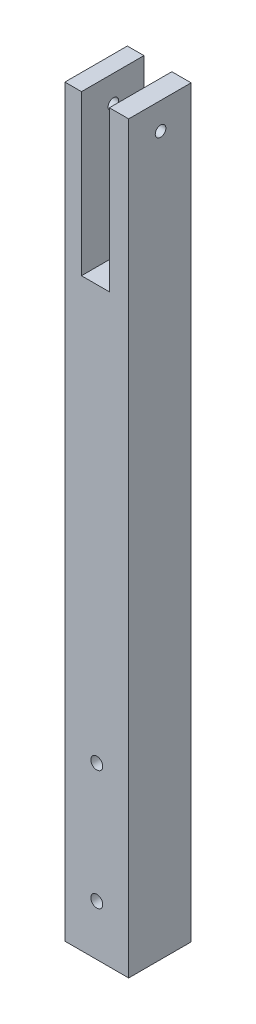
ISO-10303-21;
HEADER;
FILE_DESCRIPTION(('STEP AP214'),'2;1');
FILE_NAME('part.step','',(''),(''),'','','');
FILE_SCHEMA(('AUTOMOTIVE_DESIGN { 1 0 10303 214 1 1 1 1 }'));
ENDSEC;
DATA;
#1=APPLICATION_CONTEXT('core data for automotive mechanical design processes');
#2=APPLICATION_PROTOCOL_DEFINITION('international standard','automotive_design',2000,#1);
#3=PRODUCT_CONTEXT('',#1,'mechanical');
#4=PRODUCT('Part','Part','',(#3));
#5=PRODUCT_RELATED_PRODUCT_CATEGORY('part','',(#4));
#6=PRODUCT_DEFINITION_FORMATION('','',#4);
#7=PRODUCT_DEFINITION_CONTEXT('part definition',#1,'design');
#8=PRODUCT_DEFINITION('design','',#6,#7);
#9=PRODUCT_DEFINITION_SHAPE('','',#8);
#10=(LENGTH_UNIT() NAMED_UNIT(*) SI_UNIT(.MILLI.,.METRE.));
#11=(NAMED_UNIT(*) PLANE_ANGLE_UNIT() SI_UNIT($,.RADIAN.));
#12=(NAMED_UNIT(*) SI_UNIT($,.STERADIAN.) SOLID_ANGLE_UNIT());
#13=UNCERTAINTY_MEASURE_WITH_UNIT(LENGTH_MEASURE(1.E-05),#10,'distance_accuracy_value','');
#14=(GEOMETRIC_REPRESENTATION_CONTEXT(3) GLOBAL_UNCERTAINTY_ASSIGNED_CONTEXT((#13)) GLOBAL_UNIT_ASSIGNED_CONTEXT((#10,
#11,#12)) REPRESENTATION_CONTEXT('',''));
#15=CARTESIAN_POINT('',(0.,0.,0.));
#16=DIRECTION('',(0.,0.,1.));
#17=DIRECTION('',(1.,0.,0.));
#18=AXIS2_PLACEMENT_3D('',#15,#16,#17);
#19=CARTESIAN_POINT('',(-17.7152451401498,221.467203596135,24.));
#20=DIRECTION('',(0.,-1.,0.));
#21=DIRECTION('',(0.,0.,-1.));
#22=AXIS2_PLACEMENT_3D('',#19,#20,#21);
#23=PLANE('',#22);
#24=DIRECTION('',(0.,0.,-1.));
#25=VECTOR('',#24,1.);
#26=CARTESIAN_POINT('',(6.28475485985022,221.467203596135,24.));
#27=LINE('',#26,#25);
#28=CARTESIAN_POINT('',(6.28475485985022,221.467203596135,24.));
#29=VERTEX_POINT('',#28);
#30=CARTESIAN_POINT('',(6.28475485985022,221.467203596135,0.5));
#31=VERTEX_POINT('',#30);
#32=EDGE_CURVE('E179',#29,#31,#27,.T.);
#33=ORIENTED_EDGE('',*,*,#32,.T.);
#34=DIRECTION('',(-1.,0.,0.));
#35=VECTOR('',#34,1.);
#36=CARTESIAN_POINT('',(-17.7152451401498,221.467203596135,0.500000000000028));
#37=LINE('',#36,#35);
#38=CARTESIAN_POINT('',(-0.96524514014978,221.467203596135,0.500000000000028));
#39=VERTEX_POINT('',#38);
#40=EDGE_CURVE('E213',#31,#39,#37,.T.);
#41=ORIENTED_EDGE('',*,*,#40,.T.);
#42=DIRECTION('',(0.,0.,-1.));
#43=VECTOR('',#42,1.);
#44=CARTESIAN_POINT('',(-0.965245140149777,221.467203596135,24.));
#45=LINE('',#44,#43);
#46=CARTESIAN_POINT('',(-0.965245140149777,221.467203596135,24.));
#47=VERTEX_POINT('',#46);
#48=EDGE_CURVE('E158',#47,#39,#45,.T.);
#49=ORIENTED_EDGE('',*,*,#48,.F.);
#50=DIRECTION('',(-1.,0.,0.));
#51=VECTOR('',#50,1.);
#52=CARTESIAN_POINT('',(-17.7152451401498,221.467203596135,24.));
#53=LINE('',#52,#51);
#54=EDGE_CURVE('E168',#29,#47,#53,.T.);
#55=ORIENTED_EDGE('',*,*,#54,.F.);
#56=EDGE_LOOP('',(#33,#41,#49,#55));
#57=FACE_BOUND('',#56,.T.);
#58=ADVANCED_FACE('F37',(#57),#23,.F.);
#59=DIRECTION('',(0.,0.,1.));
#60=VECTOR('',#59,1.);
#61=CARTESIAN_POINT('',(-11.4652451401498,221.467203596135,24.));
#62=LINE('',#61,#60);
#63=CARTESIAN_POINT('',(-11.4652451401498,221.467203596135,0.500000000000028));
#64=VERTEX_POINT('',#63);
#65=CARTESIAN_POINT('',(-11.4652451401498,221.467203596135,24.));
#66=VERTEX_POINT('',#65);
#67=EDGE_CURVE('E146',#64,#66,#62,.T.);
#68=ORIENTED_EDGE('',*,*,#67,.F.);
#69=DIRECTION('',(-1.,0.,0.));
#70=VECTOR('',#69,1.);
#71=CARTESIAN_POINT('',(-17.7152451401498,221.467203596135,0.499999999999973));
#72=LINE('',#71,#70);
#73=CARTESIAN_POINT('',(-17.7152451401498,221.467203596135,0.499999999999973));
#74=VERTEX_POINT('',#73);
#75=EDGE_CURVE('E206',#64,#74,#72,.T.);
#76=ORIENTED_EDGE('',*,*,#75,.T.);
#77=DIRECTION('',(0.,0.,-1.));
#78=VECTOR('',#77,1.);
#79=CARTESIAN_POINT('',(-17.7152451401498,221.467203596135,24.));
#80=LINE('',#79,#78);
#81=CARTESIAN_POINT('',(-17.7152451401498,221.467203596135,24.));
#82=VERTEX_POINT('',#81);
#83=EDGE_CURVE('E180',#82,#74,#80,.T.);
#84=ORIENTED_EDGE('',*,*,#83,.F.);
#85=EDGE_CURVE('E166',#66,#82,#53,.T.);
#86=ORIENTED_EDGE('',*,*,#85,.F.);
#87=EDGE_LOOP('',(#68,#76,#84,#86));
#88=FACE_BOUND('',#87,.T.);
#89=ADVANCED_FACE('F286',(#88),#23,.F.);
#90=CARTESIAN_POINT('',(0.,0.,24.));
#91=DIRECTION('',(0.,0.,1.));
#92=DIRECTION('',(1.,0.,0.));
#93=AXIS2_PLACEMENT_3D('',#90,#91,#92);
#94=PLANE('',#93);
#95=CARTESIAN_POINT('',(-5.71524514014978,-39.4827964038655,24.));
#96=DIRECTION('',(0.,0.,1.));
#97=DIRECTION('',(1.,0.,0.));
#98=AXIS2_PLACEMENT_3D('',#95,#96,#97);
#99=CIRCLE('',#98,2.25);
#100=CARTESIAN_POINT('',(-3.46524514014977,-39.4827964038655,24.));
#101=VERTEX_POINT('',#100);
#102=EDGE_CURVE('E382',#101,#101,#99,.T.);
#103=ORIENTED_EDGE('',*,*,#102,.F.);
#104=EDGE_LOOP('',(#103));
#105=FACE_BOUND('',#104,.T.);
#106=CARTESIAN_POINT('',(-5.71524514014978,5.51720359613449,24.));
#107=DIRECTION('',(0.,0.,1.));
#108=DIRECTION('',(1.,0.,0.));
#109=AXIS2_PLACEMENT_3D('',#106,#107,#108);
#110=CIRCLE('',#109,2.25);
#111=CARTESIAN_POINT('',(-3.46524514014978,5.51720359613449,24.));
#112=VERTEX_POINT('',#111);
#113=EDGE_CURVE('E384',#112,#112,#110,.T.);
#114=ORIENTED_EDGE('',*,*,#113,.F.);
#115=EDGE_LOOP('',(#114));
#116=FACE_BOUND('',#115,.T.);
#117=DIRECTION('',(1.,0.,0.));
#118=VECTOR('',#117,1.);
#119=CARTESIAN_POINT('',(-0.965245140149777,161.467203596135,24.));
#120=LINE('',#119,#118);
#121=CARTESIAN_POINT('',(-11.4652451401498,161.467203596135,24.));
#122=VERTEX_POINT('',#121);
#123=CARTESIAN_POINT('',(-0.965245140149777,161.467203596135,24.));
#124=VERTEX_POINT('',#123);
#125=EDGE_CURVE('E133',#122,#124,#120,.T.);
#126=ORIENTED_EDGE('',*,*,#125,.F.);
#127=DIRECTION('',(0.,1.,0.));
#128=VECTOR('',#127,1.);
#129=CARTESIAN_POINT('',(-11.4652451401498,161.467203596135,24.));
#130=LINE('',#129,#128);
#131=EDGE_CURVE('E144',#122,#66,#130,.T.);
#132=ORIENTED_EDGE('',*,*,#131,.T.);
#133=ORIENTED_EDGE('',*,*,#85,.T.);
#134=DIRECTION('',(0.,-1.,0.));
#135=VECTOR('',#134,1.);
#136=CARTESIAN_POINT('',(-17.7152451401498,-58.5327964038655,24.));
#137=LINE('',#136,#135);
#138=CARTESIAN_POINT('',(-17.7152451401498,-58.5327964038655,24.));
#139=VERTEX_POINT('',#138);
#140=EDGE_CURVE('E174',#82,#139,#137,.T.);
#141=ORIENTED_EDGE('',*,*,#140,.T.);
#142=DIRECTION('',(1.,0.,0.));
#143=VECTOR('',#142,1.);
#144=CARTESIAN_POINT('',(-17.7152451401498,-58.5327964038655,24.));
#145=LINE('',#144,#143);
#146=CARTESIAN_POINT('',(6.28475485985022,-58.5327964038655,24.));
#147=VERTEX_POINT('',#146);
#148=EDGE_CURVE('E162',#139,#147,#145,.T.);
#149=ORIENTED_EDGE('',*,*,#148,.T.);
#150=DIRECTION('',(0.,1.,0.));
#151=VECTOR('',#150,1.);
#152=CARTESIAN_POINT('',(6.28475485985022,-58.5327964038655,24.));
#153=LINE('',#152,#151);
#154=EDGE_CURVE('E170',#147,#29,#153,.T.);
#155=ORIENTED_EDGE('',*,*,#154,.T.);
#156=ORIENTED_EDGE('',*,*,#54,.T.);
#157=DIRECTION('',(0.,1.,0.));
#158=VECTOR('',#157,1.);
#159=CARTESIAN_POINT('',(-0.965245140149777,161.467203596135,24.));
#160=LINE('',#159,#158);
#161=EDGE_CURVE('E151',#124,#47,#160,.T.);
#162=ORIENTED_EDGE('',*,*,#161,.F.);
#163=EDGE_LOOP('',(#126,#132,#133,#141,#149,#155,#156,#162));
#164=FACE_BOUND('',#163,.T.);
#165=ADVANCED_FACE('F153',(#105,#116,#164),#94,.T.);
#166=CARTESIAN_POINT('',(-17.7152451401498,-58.5327964038655,24.));
#167=DIRECTION('',(0.,1.,0.));
#168=DIRECTION('',(0.,0.,1.));
#169=AXIS2_PLACEMENT_3D('',#166,#167,#168);
#170=PLANE('',#169);
#171=DIRECTION('',(0.,0.,-1.));
#172=VECTOR('',#171,1.);
#173=CARTESIAN_POINT('',(-17.7152451401498,-58.5327964038655,24.));
#174=LINE('',#173,#172);
#175=CARTESIAN_POINT('',(-17.7152451401498,-58.5327964038655,0.500000000000028));
#176=VERTEX_POINT('',#175);
#177=EDGE_CURVE('E171',#139,#176,#174,.T.);
#178=ORIENTED_EDGE('',*,*,#177,.T.);
#179=DIRECTION('',(1.,0.,0.));
#180=VECTOR('',#179,1.);
#181=CARTESIAN_POINT('',(-17.7152451401498,-58.5327964038655,0.500000000000028));
#182=LINE('',#181,#180);
#183=CARTESIAN_POINT('',(6.28475485985022,-58.5327964038655,0.5));
#184=VERTEX_POINT('',#183);
#185=EDGE_CURVE('E249',#176,#184,#182,.T.);
#186=ORIENTED_EDGE('',*,*,#185,.T.);
#187=DIRECTION('',(0.,0.,-1.));
#188=VECTOR('',#187,1.);
#189=CARTESIAN_POINT('',(6.28475485985022,-58.5327964038655,24.));
#190=LINE('',#189,#188);
#191=EDGE_CURVE('E181',#147,#184,#190,.T.);
#192=ORIENTED_EDGE('',*,*,#191,.F.);
#193=ORIENTED_EDGE('',*,*,#148,.F.);
#194=EDGE_LOOP('',(#178,#186,#192,#193));
#195=FACE_BOUND('',#194,.T.);
#196=ADVANCED_FACE('F258',(#195),#170,.F.);
#197=CARTESIAN_POINT('',(6.28475485985022,-58.5327964038655,24.));
#198=DIRECTION('',(-1.,0.,0.));
#199=DIRECTION('',(0.,0.,1.));
#200=AXIS2_PLACEMENT_3D('',#197,#198,#199);
#201=PLANE('',#200);
#202=CARTESIAN_POINT('',(6.28475485985022,211.467203596135,12.));
#203=DIRECTION('',(-1.,0.,0.));
#204=DIRECTION('',(0.,0.,1.));
#205=AXIS2_PLACEMENT_3D('',#202,#203,#204);
#206=CIRCLE('',#205,2.);
#207=CARTESIAN_POINT('',(6.28475485985022,211.467203596135,14.));
#208=VERTEX_POINT('',#207);
#209=EDGE_CURVE('E161',#208,#208,#206,.T.);
#210=ORIENTED_EDGE('',*,*,#209,.T.);
#211=EDGE_LOOP('',(#210));
#212=FACE_BOUND('',#211,.T.);
#213=ORIENTED_EDGE('',*,*,#191,.T.);
#214=DIRECTION('',(0.,1.,0.));
#215=VECTOR('',#214,1.);
#216=CARTESIAN_POINT('',(6.28475485985022,-58.5327964038655,0.5));
#217=LINE('',#216,#215);
#218=EDGE_CURVE('E187',#184,#31,#217,.T.);
#219=ORIENTED_EDGE('',*,*,#218,.T.);
#220=ORIENTED_EDGE('',*,*,#32,.F.);
#221=ORIENTED_EDGE('',*,*,#154,.F.);
#222=EDGE_LOOP('',(#213,#219,#220,#221));
#223=FACE_BOUND('',#222,.T.);
#224=ADVANCED_FACE('F265',(#212,#223),#201,.F.);
#225=CARTESIAN_POINT('',(-17.7152451401498,-58.5327964038655,24.));
#226=DIRECTION('',(1.,0.,0.));
#227=DIRECTION('',(0.,0.,-1.));
#228=AXIS2_PLACEMENT_3D('',#225,#226,#227);
#229=PLANE('',#228);
#230=CARTESIAN_POINT('',(-17.7152451401498,211.467203596135,12.));
#231=DIRECTION('',(-1.,0.,0.));
#232=DIRECTION('',(0.,0.,1.));
#233=AXIS2_PLACEMENT_3D('',#230,#231,#232);
#234=CIRCLE('',#233,2.);
#235=CARTESIAN_POINT('',(-17.7152451401498,211.467203596135,14.));
#236=VERTEX_POINT('',#235);
#237=EDGE_CURVE('E193',#236,#236,#234,.T.);
#238=ORIENTED_EDGE('',*,*,#237,.F.);
#239=EDGE_LOOP('',(#238));
#240=FACE_BOUND('',#239,.T.);
#241=ORIENTED_EDGE('',*,*,#83,.T.);
#242=DIRECTION('',(0.,-1.,0.));
#243=VECTOR('',#242,1.);
#244=CARTESIAN_POINT('',(-17.7152451401498,-58.5327964038655,0.500000000000028));
#245=LINE('',#244,#243);
#246=EDGE_CURVE('E233',#74,#176,#245,.T.);
#247=ORIENTED_EDGE('',*,*,#246,.T.);
#248=ORIENTED_EDGE('',*,*,#177,.F.);
#249=ORIENTED_EDGE('',*,*,#140,.F.);
#250=EDGE_LOOP('',(#241,#247,#248,#249));
#251=FACE_BOUND('',#250,.T.);
#252=ADVANCED_FACE('F300',(#240,#251),#229,.F.);
#253=CARTESIAN_POINT('',(0.,0.,0.));
#254=DIRECTION('',(0.,0.,1.));
#255=DIRECTION('',(1.,0.,0.));
#256=AXIS2_PLACEMENT_3D('',#253,#254,#255);
#257=PLANE('',#256);
#258=CARTESIAN_POINT('',(-5.71524514014978,-39.4827964038655,0.));
#259=DIRECTION('',(0.,0.,1.));
#260=DIRECTION('',(1.,0.,0.));
#261=AXIS2_PLACEMENT_3D('',#258,#259,#260);
#262=CIRCLE('',#261,2.55000000000005);
#263=CARTESIAN_POINT('',(-3.16524514014973,-39.4827964038655,0.));
#264=VERTEX_POINT('',#263);
#265=EDGE_CURVE('E250',#264,#264,#262,.T.);
#266=ORIENTED_EDGE('',*,*,#265,.T.);
#267=EDGE_LOOP('',(#266));
#268=FACE_BOUND('',#267,.T.);
#269=CARTESIAN_POINT('',(-5.71524514014978,5.51720359613449,0.));
#270=DIRECTION('',(0.,0.,1.));
#271=DIRECTION('',(1.,0.,0.));
#272=AXIS2_PLACEMENT_3D('',#269,#270,#271);
#273=CIRCLE('',#272,2.55);
#274=CARTESIAN_POINT('',(-3.16524514014978,5.51720359613449,0.));
#275=VERTEX_POINT('',#274);
#276=EDGE_CURVE('E242',#275,#275,#273,.T.);
#277=ORIENTED_EDGE('',*,*,#276,.T.);
#278=EDGE_LOOP('',(#277));
#279=FACE_BOUND('',#278,.T.);
#280=DIRECTION('',(0.,-1.,0.));
#281=VECTOR('',#280,1.);
#282=CARTESIAN_POINT('',(5.78475485985025,0.,0.));
#283=LINE('',#282,#281);
#284=CARTESIAN_POINT('',(5.78475485985025,220.967203596135,0.));
#285=VERTEX_POINT('',#284);
#286=CARTESIAN_POINT('',(5.78475485985025,-58.0327964038655,0.));
#287=VERTEX_POINT('',#286);
#288=EDGE_CURVE('E192',#285,#287,#283,.T.);
#289=ORIENTED_EDGE('',*,*,#288,.T.);
#290=DIRECTION('',(-1.,0.,0.));
#291=VECTOR('',#290,1.);
#292=CARTESIAN_POINT('',(0.,-58.0327964038655,0.));
#293=LINE('',#292,#291);
#294=CARTESIAN_POINT('',(-17.2152451401498,-58.0327964038655,0.));
#295=VERTEX_POINT('',#294);
#296=EDGE_CURVE('E47',#287,#295,#293,.T.);
#297=ORIENTED_EDGE('',*,*,#296,.T.);
#298=DIRECTION('',(0.,1.,0.));
#299=VECTOR('',#298,1.);
#300=CARTESIAN_POINT('',(-17.2152451401498,0.,0.));
#301=LINE('',#300,#299);
#302=CARTESIAN_POINT('',(-17.2152451401498,220.967203596135,0.));
#303=VERTEX_POINT('',#302);
#304=EDGE_CURVE('E232',#295,#303,#301,.T.);
#305=ORIENTED_EDGE('',*,*,#304,.T.);
#306=DIRECTION('',(1.,0.,0.));
#307=VECTOR('',#306,1.);
#308=CARTESIAN_POINT('',(0.,220.967203596135,0.));
#309=LINE('',#308,#307);
#310=CARTESIAN_POINT('',(-11.9652451401498,220.967203596135,0.));
#311=VERTEX_POINT('',#310);
#312=EDGE_CURVE('E207',#303,#311,#309,.T.);
#313=ORIENTED_EDGE('',*,*,#312,.T.);
#314=DIRECTION('',(0.,-1.,0.));
#315=VECTOR('',#314,1.);
#316=CARTESIAN_POINT('',(-11.9652451401498,0.,0.));
#317=LINE('',#316,#315);
#318=CARTESIAN_POINT('',(-11.9652451401498,160.967203596135,0.));
#319=VERTEX_POINT('',#318);
#320=EDGE_CURVE('E196',#311,#319,#317,.T.);
#321=ORIENTED_EDGE('',*,*,#320,.T.);
#322=DIRECTION('',(1.,0.,0.));
#323=VECTOR('',#322,1.);
#324=CARTESIAN_POINT('',(-0.46524514014978,160.967203596135,0.));
#325=LINE('',#324,#323);
#326=CARTESIAN_POINT('',(-0.46524514014978,160.967203596135,0.));
#327=VERTEX_POINT('',#326);
#328=EDGE_CURVE('E224',#319,#327,#325,.T.);
#329=ORIENTED_EDGE('',*,*,#328,.T.);
#330=DIRECTION('',(0.,1.,0.));
#331=VECTOR('',#330,1.);
#332=CARTESIAN_POINT('',(-0.46524514014978,0.,0.));
#333=LINE('',#332,#331);
#334=CARTESIAN_POINT('',(-0.46524514014978,220.967203596135,0.));
#335=VERTEX_POINT('',#334);
#336=EDGE_CURVE('E199',#327,#335,#333,.T.);
#337=ORIENTED_EDGE('',*,*,#336,.T.);
#338=DIRECTION('',(1.,0.,0.));
#339=VECTOR('',#338,1.);
#340=CARTESIAN_POINT('',(0.,220.967203596135,0.));
#341=LINE('',#340,#339);
#342=EDGE_CURVE('E217',#335,#285,#341,.T.);
#343=ORIENTED_EDGE('',*,*,#342,.T.);
#344=EDGE_LOOP('',(#289,#297,#305,#313,#321,#329,#337,#343));
#345=FACE_BOUND('',#344,.T.);
#346=ADVANCED_FACE('F303',(#268,#279,#345),#257,.F.);
#347=CARTESIAN_POINT('',(-0.965245140149777,161.467203596135,24.));
#348=DIRECTION('',(1.,0.,0.));
#349=DIRECTION('',(0.,0.,-1.));
#350=AXIS2_PLACEMENT_3D('',#347,#348,#349);
#351=PLANE('',#350);
#352=CARTESIAN_POINT('',(-0.965245140149779,211.467203596135,12.));
#353=DIRECTION('',(1.,0.,0.));
#354=DIRECTION('',(0.,0.,-1.));
#355=AXIS2_PLACEMENT_3D('',#352,#353,#354);
#356=CIRCLE('',#355,2.);
#357=CARTESIAN_POINT('',(-0.965245140149779,211.467203596135,10.));
#358=VERTEX_POINT('',#357);
#359=EDGE_CURVE('E188',#358,#358,#356,.T.);
#360=ORIENTED_EDGE('',*,*,#359,.T.);
#361=EDGE_LOOP('',(#360));
#362=FACE_BOUND('',#361,.T.);
#363=ORIENTED_EDGE('',*,*,#48,.T.);
#364=DIRECTION('',(0.,-1.,0.));
#365=VECTOR('',#364,1.);
#366=CARTESIAN_POINT('',(-0.96524514014978,161.467203596135,0.500000000000028));
#367=LINE('',#366,#365);
#368=CARTESIAN_POINT('',(-0.96524514014978,161.467203596135,0.500000000000028));
#369=VERTEX_POINT('',#368);
#370=EDGE_CURVE('E201',#39,#369,#367,.T.);
#371=ORIENTED_EDGE('',*,*,#370,.T.);
#372=DIRECTION('',(0.,0.,-1.));
#373=VECTOR('',#372,1.);
#374=CARTESIAN_POINT('',(-0.965245140149777,161.467203596135,24.));
#375=LINE('',#374,#373);
#376=EDGE_CURVE('E142',#124,#369,#375,.T.);
#377=ORIENTED_EDGE('',*,*,#376,.F.);
#378=ORIENTED_EDGE('',*,*,#161,.T.);
#379=EDGE_LOOP('',(#363,#371,#377,#378));
#380=FACE_BOUND('',#379,.T.);
#381=ADVANCED_FACE('F274',(#362,#380),#351,.F.);
#382=CARTESIAN_POINT('',(-11.4652451401498,161.467203596135,24.));
#383=DIRECTION('',(-1.,0.,0.));
#384=DIRECTION('',(0.,0.,1.));
#385=AXIS2_PLACEMENT_3D('',#382,#383,#384);
#386=PLANE('',#385);
#387=CARTESIAN_POINT('',(-11.4652451401498,211.467203596135,12.));
#388=DIRECTION('',(-1.,0.,0.));
#389=DIRECTION('',(0.,0.,1.));
#390=AXIS2_PLACEMENT_3D('',#387,#388,#389);
#391=CIRCLE('',#390,2.);
#392=CARTESIAN_POINT('',(-11.4652451401498,211.467203596135,14.));
#393=VERTEX_POINT('',#392);
#394=EDGE_CURVE('E189',#393,#393,#391,.T.);
#395=ORIENTED_EDGE('',*,*,#394,.T.);
#396=EDGE_LOOP('',(#395));
#397=FACE_BOUND('',#396,.T.);
#398=DIRECTION('',(0.,0.,1.));
#399=VECTOR('',#398,1.);
#400=CARTESIAN_POINT('',(-11.4652451401498,161.467203596135,24.));
#401=LINE('',#400,#399);
#402=CARTESIAN_POINT('',(-11.4652451401498,161.467203596135,0.500000000000028));
#403=VERTEX_POINT('',#402);
#404=EDGE_CURVE('E128',#403,#122,#401,.T.);
#405=ORIENTED_EDGE('',*,*,#404,.F.);
#406=DIRECTION('',(0.,1.,0.));
#407=VECTOR('',#406,1.);
#408=CARTESIAN_POINT('',(-11.4652451401498,161.467203596135,0.500000000000028));
#409=LINE('',#408,#407);
#410=EDGE_CURVE('E198',#403,#64,#409,.T.);
#411=ORIENTED_EDGE('',*,*,#410,.T.);
#412=ORIENTED_EDGE('',*,*,#67,.T.);
#413=ORIENTED_EDGE('',*,*,#131,.F.);
#414=EDGE_LOOP('',(#405,#411,#412,#413));
#415=FACE_BOUND('',#414,.T.);
#416=ADVANCED_FACE('F148',(#397,#415),#386,.F.);
#417=CARTESIAN_POINT('',(0.,161.467203596135,0.));
#418=DIRECTION('',(0.,1.,0.));
#419=DIRECTION('',(0.,0.,1.));
#420=AXIS2_PLACEMENT_3D('',#417,#418,#419);
#421=PLANE('',#420);
#422=ORIENTED_EDGE('',*,*,#376,.T.);
#423=DIRECTION('',(-1.,0.,0.));
#424=VECTOR('',#423,1.);
#425=CARTESIAN_POINT('',(-11.9652451401498,161.467203596135,0.500000000000028));
#426=LINE('',#425,#424);
#427=EDGE_CURVE('E136',#369,#403,#426,.T.);
#428=ORIENTED_EDGE('',*,*,#427,.T.);
#429=ORIENTED_EDGE('',*,*,#404,.T.);
#430=ORIENTED_EDGE('',*,*,#125,.T.);
#431=EDGE_LOOP('',(#422,#428,#429,#430));
#432=FACE_BOUND('',#431,.T.);
#433=ADVANCED_FACE('F135',(#432),#421,.T.);
#434=CARTESIAN_POINT('',(9.28475485985021,211.467203596135,12.));
#435=DIRECTION('',(-1.,0.,0.));
#436=DIRECTION('',(0.,0.,1.));
#437=AXIS2_PLACEMENT_3D('',#434,#435,#436);
#438=CYLINDRICAL_SURFACE('',#437,2.);
#439=ORIENTED_EDGE('',*,*,#237,.T.);
#440=EDGE_LOOP('',(#439));
#441=FACE_BOUND('',#440,.T.);
#442=ORIENTED_EDGE('',*,*,#394,.F.);
#443=EDGE_LOOP('',(#442));
#444=FACE_BOUND('',#443,.T.);
#445=ADVANCED_FACE('F397',(#441,#444),#438,.F.);
#446=ORIENTED_EDGE('',*,*,#359,.F.);
#447=EDGE_LOOP('',(#446));
#448=FACE_BOUND('',#447,.T.);
#449=ORIENTED_EDGE('',*,*,#209,.F.);
#450=EDGE_LOOP('',(#449));
#451=FACE_BOUND('',#450,.T.);
#452=ADVANCED_FACE('F400',(#448,#451),#438,.F.);
#453=CARTESIAN_POINT('',(-5.71524514014978,5.51720359613449,27.));
#454=DIRECTION('',(0.,0.,-1.));
#455=DIRECTION('',(-1.,0.,0.));
#456=AXIS2_PLACEMENT_3D('',#453,#454,#455);
#457=CYLINDRICAL_SURFACE('',#456,2.25);
#458=CARTESIAN_POINT('',(-5.71524514014978,5.51720359613449,0.299999999999991));
#459=DIRECTION('',(0.,0.,1.));
#460=DIRECTION('',(1.,0.,0.));
#461=AXIS2_PLACEMENT_3D('',#458,#459,#460);
#462=CIRCLE('',#461,2.25);
#463=CARTESIAN_POINT('',(-3.46524514014978,5.51720359613449,0.299999999999991));
#464=VERTEX_POINT('',#463);
#465=EDGE_CURVE('E236',#464,#464,#462,.F.);
#466=ORIENTED_EDGE('',*,*,#465,.T.);
#467=EDGE_LOOP('',(#466));
#468=FACE_BOUND('',#467,.T.);
#469=ORIENTED_EDGE('',*,*,#113,.T.);
#470=EDGE_LOOP('',(#469));
#471=FACE_BOUND('',#470,.T.);
#472=ADVANCED_FACE('F377',(#468,#471),#457,.F.);
#473=CARTESIAN_POINT('',(-5.71524514014978,-39.4827964038655,27.));
#474=DIRECTION('',(0.,0.,-1.));
#475=DIRECTION('',(-1.,0.,0.));
#476=AXIS2_PLACEMENT_3D('',#473,#474,#475);
#477=CYLINDRICAL_SURFACE('',#476,2.25);
#478=CARTESIAN_POINT('',(-5.71524514014978,-39.4827964038655,0.300000000000029));
#479=DIRECTION('',(0.,0.,1.));
#480=DIRECTION('',(1.,0.,0.));
#481=AXIS2_PLACEMENT_3D('',#478,#479,#480);
#482=CIRCLE('',#481,2.25);
#483=CARTESIAN_POINT('',(-3.46524514014977,-39.4827964038655,0.300000000000029));
#484=VERTEX_POINT('',#483);
#485=EDGE_CURVE('E241',#484,#484,#482,.F.);
#486=ORIENTED_EDGE('',*,*,#485,.T.);
#487=EDGE_LOOP('',(#486));
#488=FACE_BOUND('',#487,.T.);
#489=ORIENTED_EDGE('',*,*,#102,.T.);
#490=EDGE_LOOP('',(#489));
#491=FACE_BOUND('',#490,.T.);
#492=ADVANCED_FACE('F328',(#488,#491),#477,.F.);
#493=CARTESIAN_POINT('',(6.28475485985022,-58.5327964038655,0.5));
#494=DIRECTION('',(-0.707106781186567,0.,0.707106781186528));
#495=DIRECTION('',(0.,1.,0.));
#496=AXIS2_PLACEMENT_3D('',#493,#494,#495);
#497=PLANE('',#496);
#498=ORIENTED_EDGE('',*,*,#218,.F.);
#499=DIRECTION('',(-0.577350269189615,0.577350269189615,-0.577350269189647));
#500=VECTOR('',#499,1.);
#501=CARTESIAN_POINT('',(6.28475485985023,-58.5327964038655,0.50000000000001));
#502=LINE('',#501,#500);
#503=EDGE_CURVE('E65',#184,#287,#502,.T.);
#504=ORIENTED_EDGE('',*,*,#503,.T.);
#505=ORIENTED_EDGE('',*,*,#288,.F.);
#506=DIRECTION('',(0.577350269189615,0.577350269189615,0.577350269189647));
#507=VECTOR('',#506,1.);
#508=CARTESIAN_POINT('',(-87.0485784734797,128.133870262805,-92.8333333333351));
#509=LINE('',#508,#507);
#510=EDGE_CURVE('E219',#285,#31,#509,.T.);
#511=ORIENTED_EDGE('',*,*,#510,.T.);
#512=EDGE_LOOP('',(#498,#504,#505,#511));
#513=FACE_BOUND('',#512,.T.);
#514=ADVANCED_FACE('F262',(#513),#497,.F.);
#515=CARTESIAN_POINT('',(-11.4652451401498,161.467203596135,0.500000000000028));
#516=DIRECTION('',(-0.707106781186548,0.,0.707106781186548));
#517=DIRECTION('',(0.,1.,0.));
#518=AXIS2_PLACEMENT_3D('',#515,#516,#517);
#519=PLANE('',#518);
#520=ORIENTED_EDGE('',*,*,#320,.F.);
#521=DIRECTION('',(0.577350269189615,0.577350269189647,0.577350269189615));
#522=VECTOR('',#521,1.);
#523=CARTESIAN_POINT('',(-31.4652451401502,201.467203596133,-19.5000000000004));
#524=LINE('',#523,#522);
#525=EDGE_CURVE('E211',#311,#64,#524,.T.);
#526=ORIENTED_EDGE('',*,*,#525,.T.);
#527=ORIENTED_EDGE('',*,*,#410,.F.);
#528=DIRECTION('',(0.577350269189636,0.577350269189604,0.577350269189636));
#529=VECTOR('',#528,1.);
#530=CARTESIAN_POINT('',(-7.64349676009971,165.288951976184,4.3217483800501));
#531=LINE('',#530,#529);
#532=EDGE_CURVE('E227',#403,#319,#531,.F.);
#533=ORIENTED_EDGE('',*,*,#532,.T.);
#534=EDGE_LOOP('',(#520,#526,#527,#533));
#535=FACE_BOUND('',#534,.T.);
#536=ADVANCED_FACE('F281',(#535),#519,.F.);
#537=CARTESIAN_POINT('',(-0.46524514014978,0.,0.));
#538=DIRECTION('',(0.707106781186567,0.,0.707106781186528));
#539=DIRECTION('',(0.,1.,0.));
#540=AXIS2_PLACEMENT_3D('',#537,#538,#539);
#541=PLANE('',#540);
#542=ORIENTED_EDGE('',*,*,#370,.F.);
#543=DIRECTION('',(0.577350269189615,-0.577350269189615,-0.577350269189647));
#544=VECTOR('',#543,1.);
#545=CARTESIAN_POINT('',(73.1904893918923,147.311469064092,-73.6557345320462));
#546=LINE('',#545,#544);
#547=EDGE_CURVE('E216',#39,#335,#546,.T.);
#548=ORIENTED_EDGE('',*,*,#547,.T.);
#549=ORIENTED_EDGE('',*,*,#336,.F.);
#550=DIRECTION('',(0.577350269189615,-0.577350269189615,-0.577350269189647));
#551=VECTOR('',#550,1.);
#552=CARTESIAN_POINT('',(-0.643496760099865,161.145455216085,0.178251619950096));
#553=LINE('',#552,#551);
#554=EDGE_CURVE('E226',#327,#369,#553,.F.);
#555=ORIENTED_EDGE('',*,*,#554,.T.);
#556=EDGE_LOOP('',(#542,#548,#549,#555));
#557=FACE_BOUND('',#556,.T.);
#558=ADVANCED_FACE('F280',(#557),#541,.F.);
#559=CARTESIAN_POINT('',(-17.7152451401498,221.467203596135,0.499999999999973));
#560=DIRECTION('',(0.,-0.707106781186528,0.707106781186567));
#561=DIRECTION('',(-1.,0.,0.));
#562=AXIS2_PLACEMENT_3D('',#559,#560,#561);
#563=PLANE('',#562);
#564=ORIENTED_EDGE('',*,*,#312,.F.);
#565=DIRECTION('',(-0.577350269189594,0.577350269189658,0.577350269189626));
#566=VECTOR('',#565,1.);
#567=CARTESIAN_POINT('',(-17.7152451401497,221.467203596135,0.499999999999991));
#568=LINE('',#567,#566);
#569=EDGE_CURVE('E237',#303,#74,#568,.T.);
#570=ORIENTED_EDGE('',*,*,#569,.T.);
#571=ORIENTED_EDGE('',*,*,#75,.F.);
#572=ORIENTED_EDGE('',*,*,#525,.F.);
#573=EDGE_LOOP('',(#564,#570,#571,#572));
#574=FACE_BOUND('',#573,.T.);
#575=ADVANCED_FACE('F295',(#574),#563,.F.);
#576=CARTESIAN_POINT('',(-17.7152451401498,221.467203596135,0.500000000000028));
#577=DIRECTION('',(0.,-0.707106781186567,0.707106781186528));
#578=DIRECTION('',(-1.,0.,0.));
#579=AXIS2_PLACEMENT_3D('',#576,#577,#578);
#580=PLANE('',#579);
#581=ORIENTED_EDGE('',*,*,#510,.F.);
#582=ORIENTED_EDGE('',*,*,#342,.F.);
#583=ORIENTED_EDGE('',*,*,#547,.F.);
#584=ORIENTED_EDGE('',*,*,#40,.F.);
#585=EDGE_LOOP('',(#581,#582,#583,#584));
#586=FACE_BOUND('',#585,.T.);
#587=ADVANCED_FACE('F267',(#586),#580,.F.);
#588=CARTESIAN_POINT('',(0.,161.467203596135,0.500000000000028));
#589=DIRECTION('',(0.,0.707106781186567,-0.707106781186528));
#590=DIRECTION('',(1.,0.,0.));
#591=AXIS2_PLACEMENT_3D('',#588,#589,#590);
#592=PLANE('',#591);
#593=ORIENTED_EDGE('',*,*,#554,.F.);
#594=ORIENTED_EDGE('',*,*,#328,.F.);
#595=ORIENTED_EDGE('',*,*,#532,.F.);
#596=ORIENTED_EDGE('',*,*,#427,.F.);
#597=EDGE_LOOP('',(#593,#594,#595,#596));
#598=FACE_BOUND('',#597,.T.);
#599=ADVANCED_FACE('F282',(#598),#592,.T.);
#600=CARTESIAN_POINT('',(-17.7152451401498,-58.5327964038655,0.500000000000028));
#601=DIRECTION('',(0.707106781186567,0.,0.707106781186528));
#602=DIRECTION('',(0.,-1.,0.));
#603=AXIS2_PLACEMENT_3D('',#600,#601,#602);
#604=PLANE('',#603);
#605=ORIENTED_EDGE('',*,*,#304,.F.);
#606=DIRECTION('',(-0.577350269189615,-0.577350269189615,0.577350269189647));
#607=VECTOR('',#606,1.);
#608=CARTESIAN_POINT('',(-17.7152451401498,-58.5327964038655,0.500000000000028));
#609=LINE('',#608,#607);
#610=EDGE_CURVE('E11',#295,#176,#609,.T.);
#611=ORIENTED_EDGE('',*,*,#610,.T.);
#612=ORIENTED_EDGE('',*,*,#246,.F.);
#613=ORIENTED_EDGE('',*,*,#569,.F.);
#614=EDGE_LOOP('',(#605,#611,#612,#613));
#615=FACE_BOUND('',#614,.T.);
#616=ADVANCED_FACE('F297',(#615),#604,.F.);
#617=CARTESIAN_POINT('',(-5.71524514014978,5.51720359613449,0.299999999999991));
#618=DIRECTION('',(0.,0.,-1.));
#619=DIRECTION('',(-1.,0.,0.));
#620=AXIS2_PLACEMENT_3D('',#617,#618,#619);
#621=CONICAL_SURFACE('',#620,2.25,0.785398163397454);
#622=ORIENTED_EDGE('',*,*,#276,.F.);
#623=EDGE_LOOP('',(#622));
#624=FACE_BOUND('',#623,.T.);
#625=ORIENTED_EDGE('',*,*,#465,.F.);
#626=EDGE_LOOP('',(#625));
#627=FACE_BOUND('',#626,.T.);
#628=ADVANCED_FACE('F357',(#624,#627),#621,.F.);
#629=CARTESIAN_POINT('',(-5.71524514014978,-39.4827964038655,0.300000000000029));
#630=DIRECTION('',(0.,0.,-1.));
#631=DIRECTION('',(-1.,0.,0.));
#632=AXIS2_PLACEMENT_3D('',#629,#630,#631);
#633=CONICAL_SURFACE('',#632,2.25,0.785398163397481);
#634=ORIENTED_EDGE('',*,*,#265,.F.);
#635=EDGE_LOOP('',(#634));
#636=FACE_BOUND('',#635,.T.);
#637=ORIENTED_EDGE('',*,*,#485,.F.);
#638=EDGE_LOOP('',(#637));
#639=FACE_BOUND('',#638,.T.);
#640=ADVANCED_FACE('F365',(#636,#639),#633,.F.);
#641=CARTESIAN_POINT('',(-17.7152451401498,-58.5327964038655,0.500000000000028));
#642=DIRECTION('',(0.,0.707106781186567,0.707106781186528));
#643=DIRECTION('',(1.,0.,0.));
#644=AXIS2_PLACEMENT_3D('',#641,#642,#643);
#645=PLANE('',#644);
#646=ORIENTED_EDGE('',*,*,#610,.F.);
#647=ORIENTED_EDGE('',*,*,#296,.F.);
#648=ORIENTED_EDGE('',*,*,#503,.F.);
#649=ORIENTED_EDGE('',*,*,#185,.F.);
#650=EDGE_LOOP('',(#646,#647,#648,#649));
#651=FACE_BOUND('',#650,.T.);
#652=ADVANCED_FACE('F43',(#651),#645,.F.);
#653=CLOSED_SHELL('',(#58,#89,#165,#196,#224,#252,#346,#381,#416,#433,#445,#452,#472,#492,#514,
#536,#558,#575,#587,#599,#616,#628,#640,#652));
#654=MANIFOLD_SOLID_BREP('B2',#653);
#655=ADVANCED_BREP_SHAPE_REPRESENTATION('',(#18,#654),#14);
#656=SHAPE_DEFINITION_REPRESENTATION(#9,#655);
ENDSEC;
END-ISO-10303-21;
